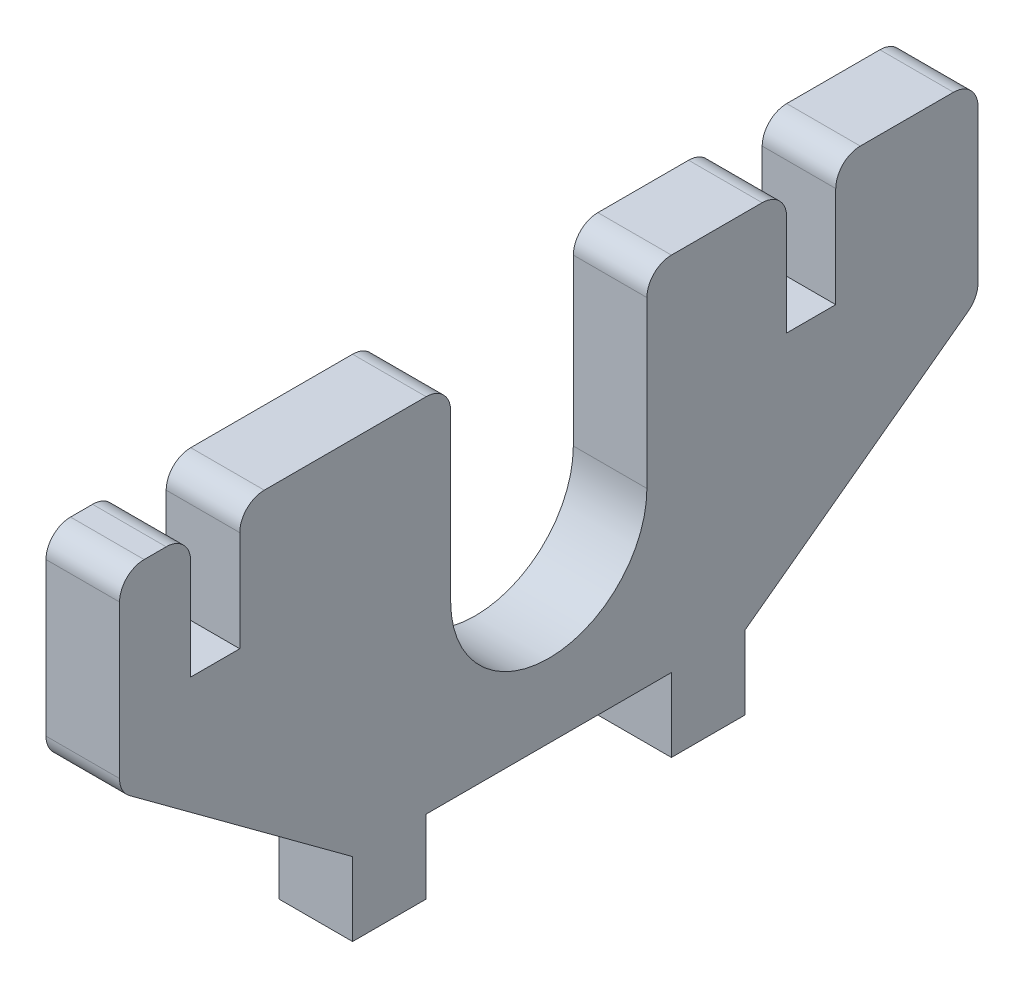
ISO-10303-21;
HEADER;
FILE_DESCRIPTION(('STEP AP214'),'2;1');
FILE_NAME('part.step','',(''),(''),'','','');
FILE_SCHEMA(('AUTOMOTIVE_DESIGN { 1 0 10303 214 1 1 1 1 }'));
ENDSEC;
DATA;
#1=APPLICATION_CONTEXT('core data for automotive mechanical design processes');
#2=APPLICATION_PROTOCOL_DEFINITION('international standard','automotive_design',2000,#1);
#3=PRODUCT_CONTEXT('',#1,'mechanical');
#4=PRODUCT('Part','Part','',(#3));
#5=PRODUCT_RELATED_PRODUCT_CATEGORY('part','',(#4));
#6=PRODUCT_DEFINITION_FORMATION('','',#4);
#7=PRODUCT_DEFINITION_CONTEXT('part definition',#1,'design');
#8=PRODUCT_DEFINITION('design','',#6,#7);
#9=PRODUCT_DEFINITION_SHAPE('','',#8);
#10=(LENGTH_UNIT() NAMED_UNIT(*) SI_UNIT(.MILLI.,.METRE.));
#11=(NAMED_UNIT(*) PLANE_ANGLE_UNIT() SI_UNIT($,.RADIAN.));
#12=(NAMED_UNIT(*) SI_UNIT($,.STERADIAN.) SOLID_ANGLE_UNIT());
#13=UNCERTAINTY_MEASURE_WITH_UNIT(LENGTH_MEASURE(1.E-05),#10,'distance_accuracy_value','');
#14=(GEOMETRIC_REPRESENTATION_CONTEXT(3) GLOBAL_UNCERTAINTY_ASSIGNED_CONTEXT((#13)) GLOBAL_UNIT_ASSIGNED_CONTEXT((#10,
#11,#12)) REPRESENTATION_CONTEXT('',''));
#15=CARTESIAN_POINT('',(0.,0.,0.));
#16=DIRECTION('',(0.,0.,1.));
#17=DIRECTION('',(1.,0.,0.));
#18=AXIS2_PLACEMENT_3D('',#15,#16,#17);
#19=CARTESIAN_POINT('',(0.,0.,0.));
#20=DIRECTION('',(0.,1.,0.));
#21=DIRECTION('',(0.,0.,1.));
#22=AXIS2_PLACEMENT_3D('',#19,#20,#21);
#23=PLANE('',#22);
#24=DIRECTION('',(0.,0.,-1.));
#25=VECTOR('',#24,1.);
#26=CARTESIAN_POINT('',(1185.,0.,0.));
#27=LINE('',#26,#25);
#28=CARTESIAN_POINT('',(1185.,0.,39.9999999999999));
#29=VERTEX_POINT('',#28);
#30=CARTESIAN_POINT('',(1185.,0.,24.9999999999999));
#31=VERTEX_POINT('',#30);
#32=EDGE_CURVE('E331',#29,#31,#27,.T.);
#33=ORIENTED_EDGE('',*,*,#32,.T.);
#34=DIRECTION('',(1.,0.,0.));
#35=VECTOR('',#34,1.);
#36=CARTESIAN_POINT('',(1185.,0.,24.9999999999999));
#37=LINE('',#36,#35);
#38=CARTESIAN_POINT('',(1200.,0.,24.9999999999999));
#39=VERTEX_POINT('',#38);
#40=EDGE_CURVE('E318',#31,#39,#37,.T.);
#41=ORIENTED_EDGE('',*,*,#40,.T.);
#42=DIRECTION('',(0.,0.,-1.));
#43=VECTOR('',#42,1.);
#44=CARTESIAN_POINT('',(1200.,0.,-40.0000000000001));
#45=LINE('',#44,#43);
#46=CARTESIAN_POINT('',(1200.,0.,39.9999999999999));
#47=VERTEX_POINT('',#46);
#48=EDGE_CURVE('E447',#47,#39,#45,.T.);
#49=ORIENTED_EDGE('',*,*,#48,.F.);
#50=DIRECTION('',(1.,0.,0.));
#51=VECTOR('',#50,1.);
#52=CARTESIAN_POINT('',(600.,0.,39.9999999999999));
#53=LINE('',#52,#51);
#54=EDGE_CURVE('E338',#29,#47,#53,.T.);
#55=ORIENTED_EDGE('',*,*,#54,.F.);
#56=EDGE_LOOP('',(#33,#41,#49,#55));
#57=FACE_BOUND('',#56,.T.);
#58=ADVANCED_FACE('F95',(#57),#23,.F.);
#59=CARTESIAN_POINT('',(1125.,50.,0.));
#60=DIRECTION('',(1.,0.,0.));
#61=DIRECTION('',(0.,0.,-1.));
#62=AXIS2_PLACEMENT_3D('',#59,#60,#61);
#63=CYLINDRICAL_SURFACE('',#62,20.);
#64=CARTESIAN_POINT('',(1185.,50.,0.));
#65=DIRECTION('',(-1.,0.,0.));
#66=DIRECTION('',(0.,0.,1.));
#67=AXIS2_PLACEMENT_3D('',#64,#65,#66);
#68=CIRCLE('',#67,20.);
#69=CARTESIAN_POINT('',(1185.,50.,20.));
#70=VERTEX_POINT('',#69);
#71=CARTESIAN_POINT('',(1185.,50.,-20.));
#72=VERTEX_POINT('',#71);
#73=EDGE_CURVE('E351',#70,#72,#68,.F.);
#74=ORIENTED_EDGE('',*,*,#73,.F.);
#75=DIRECTION('',(1.,0.,0.));
#76=VECTOR('',#75,1.);
#77=CARTESIAN_POINT('',(1125.,50.,20.));
#78=LINE('',#77,#76);
#79=CARTESIAN_POINT('',(1200.,50.,20.));
#80=VERTEX_POINT('',#79);
#81=EDGE_CURVE('E421',#70,#80,#78,.T.);
#82=ORIENTED_EDGE('',*,*,#81,.T.);
#83=CARTESIAN_POINT('',(1200.,50.,0.));
#84=DIRECTION('',(1.,0.,0.));
#85=DIRECTION('',(0.,0.,-1.));
#86=AXIS2_PLACEMENT_3D('',#83,#84,#85);
#87=CIRCLE('',#86,20.);
#88=CARTESIAN_POINT('',(1200.,50.,-20.));
#89=VERTEX_POINT('',#88);
#90=EDGE_CURVE('E382',#80,#89,#87,.T.);
#91=ORIENTED_EDGE('',*,*,#90,.T.);
#92=DIRECTION('',(1.,0.,0.));
#93=VECTOR('',#92,1.);
#94=CARTESIAN_POINT('',(1125.,50.,-20.));
#95=LINE('',#94,#93);
#96=EDGE_CURVE('E422',#72,#89,#95,.T.);
#97=ORIENTED_EDGE('',*,*,#96,.F.);
#98=EDGE_LOOP('',(#74,#82,#91,#97));
#99=FACE_BOUND('',#98,.T.);
#100=ADVANCED_FACE('F664',(#99),#63,.F.);
#101=CARTESIAN_POINT('',(1125.,0.,-20.));
#102=DIRECTION('',(0.,0.,1.));
#103=DIRECTION('',(1.,0.,0.));
#104=AXIS2_PLACEMENT_3D('',#101,#102,#103);
#105=PLANE('',#104);
#106=DIRECTION('',(0.,-1.,0.));
#107=VECTOR('',#106,1.);
#108=CARTESIAN_POINT('',(1200.,0.,-20.));
#109=LINE('',#108,#107);
#110=CARTESIAN_POINT('',(1200.,83.7000000000001,-20.));
#111=VERTEX_POINT('',#110);
#112=EDGE_CURVE('E419',#111,#89,#109,.T.);
#113=ORIENTED_EDGE('',*,*,#112,.F.);
#114=DIRECTION('',(1.,0.,0.));
#115=VECTOR('',#114,1.);
#116=CARTESIAN_POINT('',(1185.,83.7000000000001,-20.));
#117=LINE('',#116,#115);
#118=CARTESIAN_POINT('',(1185.,83.7000000000001,-20.));
#119=VERTEX_POINT('',#118);
#120=EDGE_CURVE('E528',#111,#119,#117,.F.);
#121=ORIENTED_EDGE('',*,*,#120,.T.);
#122=DIRECTION('',(0.,-1.,0.));
#123=VECTOR('',#122,1.);
#124=CARTESIAN_POINT('',(1185.,0.,-20.));
#125=LINE('',#124,#123);
#126=EDGE_CURVE('E354',#119,#72,#125,.T.);
#127=ORIENTED_EDGE('',*,*,#126,.T.);
#128=ORIENTED_EDGE('',*,*,#96,.T.);
#129=EDGE_LOOP('',(#113,#121,#127,#128));
#130=FACE_BOUND('',#129,.T.);
#131=ADVANCED_FACE('F669',(#130),#105,.T.);
#132=CARTESIAN_POINT('',(1125.,88.7000000000001,0.));
#133=DIRECTION('',(0.,-1.,0.));
#134=DIRECTION('',(0.,0.,-1.));
#135=AXIS2_PLACEMENT_3D('',#132,#133,#134);
#136=PLANE('',#135);
#137=DIRECTION('',(0.,0.,-1.));
#138=VECTOR('',#137,1.);
#139=CARTESIAN_POINT('',(1200.,88.7000000000001,0.));
#140=LINE('',#139,#138);
#141=CARTESIAN_POINT('',(1200.,88.7000000000001,-25.));
#142=VERTEX_POINT('',#141);
#143=CARTESIAN_POINT('',(1200.,88.7000000000001,-43.5000000000001));
#144=VERTEX_POINT('',#143);
#145=EDGE_CURVE('E418',#142,#144,#140,.T.);
#146=ORIENTED_EDGE('',*,*,#145,.T.);
#147=DIRECTION('',(1.,0.,0.));
#148=VECTOR('',#147,1.);
#149=CARTESIAN_POINT('',(1125.,88.7000000000001,-43.5000000000001));
#150=LINE('',#149,#148);
#151=CARTESIAN_POINT('',(1185.,88.7000000000001,-43.5000000000001));
#152=VERTEX_POINT('',#151);
#153=EDGE_CURVE('E526',#144,#152,#150,.F.);
#154=ORIENTED_EDGE('',*,*,#153,.T.);
#155=DIRECTION('',(0.,0.,1.));
#156=VECTOR('',#155,1.);
#157=CARTESIAN_POINT('',(1185.,88.7000000000001,-300.));
#158=LINE('',#157,#156);
#159=CARTESIAN_POINT('',(1185.,88.7000000000001,-25.));
#160=VERTEX_POINT('',#159);
#161=EDGE_CURVE('E347',#152,#160,#158,.T.);
#162=ORIENTED_EDGE('',*,*,#161,.T.);
#163=DIRECTION('',(1.,0.,0.));
#164=VECTOR('',#163,1.);
#165=CARTESIAN_POINT('',(1200.,88.7000000000001,-25.));
#166=LINE('',#165,#164);
#167=EDGE_CURVE('E523',#160,#142,#166,.T.);
#168=ORIENTED_EDGE('',*,*,#167,.T.);
#169=EDGE_LOOP('',(#146,#154,#162,#168));
#170=FACE_BOUND('',#169,.T.);
#171=ADVANCED_FACE('F673',(#170),#136,.F.);
#172=CARTESIAN_POINT('',(1125.,0.,-48.5000000000001));
#173=DIRECTION('',(0.,0.,1.));
#174=DIRECTION('',(0.,-1.,0.));
#175=AXIS2_PLACEMENT_3D('',#172,#173,#174);
#176=PLANE('',#175);
#177=DIRECTION('',(0.,-1.,0.));
#178=VECTOR('',#177,1.);
#179=CARTESIAN_POINT('',(1185.,0.,-48.5000000000001));
#180=LINE('',#179,#178);
#181=CARTESIAN_POINT('',(1185.,83.7000000000001,-48.5000000000001));
#182=VERTEX_POINT('',#181);
#183=CARTESIAN_POINT('',(1185.,63.2000000000001,-48.5000000000001));
#184=VERTEX_POINT('',#183);
#185=EDGE_CURVE('E380',#182,#184,#180,.T.);
#186=ORIENTED_EDGE('',*,*,#185,.F.);
#187=DIRECTION('',(1.,0.,0.));
#188=VECTOR('',#187,1.);
#189=CARTESIAN_POINT('',(1125.,83.7000000000001,-48.5000000000001));
#190=LINE('',#189,#188);
#191=CARTESIAN_POINT('',(1200.,83.7000000000001,-48.5000000000001));
#192=VERTEX_POINT('',#191);
#193=EDGE_CURVE('E520',#182,#192,#190,.T.);
#194=ORIENTED_EDGE('',*,*,#193,.T.);
#195=DIRECTION('',(0.,-1.,0.));
#196=VECTOR('',#195,1.);
#197=CARTESIAN_POINT('',(1200.,0.,-48.5000000000001));
#198=LINE('',#197,#196);
#199=CARTESIAN_POINT('',(1200.,63.2000000000001,-48.5000000000001));
#200=VERTEX_POINT('',#199);
#201=EDGE_CURVE('E416',#192,#200,#198,.T.);
#202=ORIENTED_EDGE('',*,*,#201,.T.);
#203=DIRECTION('',(1.,0.,0.));
#204=VECTOR('',#203,1.);
#205=CARTESIAN_POINT('',(1125.,63.2000000000001,-48.5000000000001));
#206=LINE('',#205,#204);
#207=EDGE_CURVE('E425',#184,#200,#206,.T.);
#208=ORIENTED_EDGE('',*,*,#207,.F.);
#209=EDGE_LOOP('',(#186,#194,#202,#208));
#210=FACE_BOUND('',#209,.T.);
#211=ADVANCED_FACE('F682',(#210),#176,.F.);
#212=CARTESIAN_POINT('',(1125.,63.2000000000001,0.));
#213=DIRECTION('',(0.,-1.,0.));
#214=DIRECTION('',(0.,0.,-1.));
#215=AXIS2_PLACEMENT_3D('',#212,#213,#214);
#216=PLANE('',#215);
#217=DIRECTION('',(0.,0.,-1.));
#218=VECTOR('',#217,1.);
#219=CARTESIAN_POINT('',(1185.,63.2000000000001,0.));
#220=LINE('',#219,#218);
#221=CARTESIAN_POINT('',(1185.,63.2000000000001,-58.5000000000001));
#222=VERTEX_POINT('',#221);
#223=EDGE_CURVE('E377',#184,#222,#220,.T.);
#224=ORIENTED_EDGE('',*,*,#223,.F.);
#225=ORIENTED_EDGE('',*,*,#207,.T.);
#226=DIRECTION('',(0.,0.,-1.));
#227=VECTOR('',#226,1.);
#228=CARTESIAN_POINT('',(1200.,63.2000000000001,0.));
#229=LINE('',#228,#227);
#230=CARTESIAN_POINT('',(1200.,63.2000000000001,-58.5000000000001));
#231=VERTEX_POINT('',#230);
#232=EDGE_CURVE('E413',#200,#231,#229,.T.);
#233=ORIENTED_EDGE('',*,*,#232,.T.);
#234=DIRECTION('',(1.,0.,0.));
#235=VECTOR('',#234,1.);
#236=CARTESIAN_POINT('',(1125.,63.2000000000001,-58.5000000000001));
#237=LINE('',#236,#235);
#238=EDGE_CURVE('E428',#222,#231,#237,.T.);
#239=ORIENTED_EDGE('',*,*,#238,.F.);
#240=EDGE_LOOP('',(#224,#225,#233,#239));
#241=FACE_BOUND('',#240,.T.);
#242=ADVANCED_FACE('F688',(#241),#216,.F.);
#243=CARTESIAN_POINT('',(1125.,0.,-58.5000000000001));
#244=DIRECTION('',(0.,0.,1.));
#245=DIRECTION('',(0.,-1.,0.));
#246=AXIS2_PLACEMENT_3D('',#243,#244,#245);
#247=PLANE('',#246);
#248=DIRECTION('',(0.,-1.,0.));
#249=VECTOR('',#248,1.);
#250=CARTESIAN_POINT('',(1200.,0.,-58.5000000000001));
#251=LINE('',#250,#249);
#252=CARTESIAN_POINT('',(1200.,83.7000000000001,-58.5000000000001));
#253=VERTEX_POINT('',#252);
#254=EDGE_CURVE('E411',#253,#231,#251,.T.);
#255=ORIENTED_EDGE('',*,*,#254,.F.);
#256=DIRECTION('',(1.,0.,0.));
#257=VECTOR('',#256,1.);
#258=CARTESIAN_POINT('',(1185.,83.7000000000001,-58.5000000000001));
#259=LINE('',#258,#257);
#260=CARTESIAN_POINT('',(1185.,83.7000000000001,-58.5000000000001));
#261=VERTEX_POINT('',#260);
#262=EDGE_CURVE('E518',#253,#261,#259,.F.);
#263=ORIENTED_EDGE('',*,*,#262,.T.);
#264=DIRECTION('',(0.,-1.,0.));
#265=VECTOR('',#264,1.);
#266=CARTESIAN_POINT('',(1185.,0.,-58.5000000000001));
#267=LINE('',#266,#265);
#268=EDGE_CURVE('E375',#261,#222,#267,.T.);
#269=ORIENTED_EDGE('',*,*,#268,.T.);
#270=ORIENTED_EDGE('',*,*,#238,.T.);
#271=EDGE_LOOP('',(#255,#263,#269,#270));
#272=FACE_BOUND('',#271,.T.);
#273=ADVANCED_FACE('F691',(#272),#247,.T.);
#274=CARTESIAN_POINT('',(1200.,88.7000000000001,-63.5000000000001));
#275=VERTEX_POINT('',#274);
#276=CARTESIAN_POINT('',(1200.,88.7000000000001,-82.5));
#277=VERTEX_POINT('',#276);
#278=EDGE_CURVE('E394',#275,#277,#140,.T.);
#279=ORIENTED_EDGE('',*,*,#278,.T.);
#280=DIRECTION('',(1.,0.,0.));
#281=VECTOR('',#280,1.);
#282=CARTESIAN_POINT('',(1125.,88.7000000000001,-82.5));
#283=LINE('',#282,#281);
#284=CARTESIAN_POINT('',(1185.,88.7000000000001,-82.5));
#285=VERTEX_POINT('',#284);
#286=EDGE_CURVE('E516',#277,#285,#283,.F.);
#287=ORIENTED_EDGE('',*,*,#286,.T.);
#288=CARTESIAN_POINT('',(1185.,88.7000000000001,-63.5000000000001));
#289=VERTEX_POINT('',#288);
#290=EDGE_CURVE('E349',#285,#289,#158,.T.);
#291=ORIENTED_EDGE('',*,*,#290,.T.);
#292=DIRECTION('',(1.,0.,0.));
#293=VECTOR('',#292,1.);
#294=CARTESIAN_POINT('',(1200.,88.7000000000001,-63.5000000000001));
#295=LINE('',#294,#293);
#296=EDGE_CURVE('E513',#289,#275,#295,.T.);
#297=ORIENTED_EDGE('',*,*,#296,.T.);
#298=EDGE_LOOP('',(#279,#287,#291,#297));
#299=FACE_BOUND('',#298,.T.);
#300=ADVANCED_FACE('F640',(#299),#136,.F.);
#301=CARTESIAN_POINT('',(1125.,0.,-87.5));
#302=DIRECTION('',(0.,0.,1.));
#303=DIRECTION('',(1.,0.,0.));
#304=AXIS2_PLACEMENT_3D('',#301,#302,#303);
#305=PLANE('',#304);
#306=DIRECTION('',(0.,-1.,0.));
#307=VECTOR('',#306,1.);
#308=CARTESIAN_POINT('',(1200.,0.,-87.5));
#309=LINE('',#308,#307);
#310=CARTESIAN_POINT('',(1200.,83.7000000000001,-87.5));
#311=VERTEX_POINT('',#310);
#312=CARTESIAN_POINT('',(1200.,52.5265388006347,-87.5));
#313=VERTEX_POINT('',#312);
#314=EDGE_CURVE('E408',#311,#313,#309,.T.);
#315=ORIENTED_EDGE('',*,*,#314,.T.);
#316=DIRECTION('',(1.,0.,0.));
#317=VECTOR('',#316,1.);
#318=CARTESIAN_POINT('',(1125.,52.5265388006347,-87.5));
#319=LINE('',#318,#317);
#320=CARTESIAN_POINT('',(1185.,52.5265388006347,-87.5));
#321=VERTEX_POINT('',#320);
#322=EDGE_CURVE('E511',#313,#321,#319,.F.);
#323=ORIENTED_EDGE('',*,*,#322,.T.);
#324=DIRECTION('',(0.,-1.,0.));
#325=VECTOR('',#324,1.);
#326=CARTESIAN_POINT('',(1185.,0.,-87.5));
#327=LINE('',#326,#325);
#328=CARTESIAN_POINT('',(1185.,83.7000000000001,-87.5));
#329=VERTEX_POINT('',#328);
#330=EDGE_CURVE('E372',#329,#321,#327,.T.);
#331=ORIENTED_EDGE('',*,*,#330,.F.);
#332=DIRECTION('',(1.,0.,0.));
#333=VECTOR('',#332,1.);
#334=CARTESIAN_POINT('',(1125.,83.7000000000001,-87.5));
#335=LINE('',#334,#333);
#336=EDGE_CURVE('E508',#329,#311,#335,.T.);
#337=ORIENTED_EDGE('',*,*,#336,.T.);
#338=EDGE_LOOP('',(#315,#323,#331,#337));
#339=FACE_BOUND('',#338,.T.);
#340=ADVANCED_FACE('F629',(#339),#305,.F.);
#341=CARTESIAN_POINT('',(1125.,-9.38061041292646,-6.91202872531425));
#342=DIRECTION('',(0.,0.805055837353367,0.593199038049851));
#343=DIRECTION('',(0.,-0.593199038049851,0.805055837353367));
#344=AXIS2_PLACEMENT_3D('',#341,#342,#343);
#345=PLANE('',#344);
#346=DIRECTION('',(0.,-0.593199038049851,0.805055837353367));
#347=VECTOR('',#346,1.);
#348=CARTESIAN_POINT('',(1185.,-9.38061041292646,-6.91202872531425));
#349=LINE('',#348,#347);
#350=CARTESIAN_POINT('',(1185.,48.5012596138679,-85.4659951902492));
#351=VERTEX_POINT('',#350);
#352=CARTESIAN_POINT('',(1185.,15.,-40.0000000000001));
#353=VERTEX_POINT('',#352);
#354=EDGE_CURVE('E369',#351,#353,#349,.T.);
#355=ORIENTED_EDGE('',*,*,#354,.F.);
#356=DIRECTION('',(1.,0.,0.));
#357=VECTOR('',#356,1.);
#358=CARTESIAN_POINT('',(1125.,48.5012596138679,-85.4659951902492));
#359=LINE('',#358,#357);
#360=CARTESIAN_POINT('',(1200.,48.5012596138679,-85.4659951902493));
#361=VERTEX_POINT('',#360);
#362=EDGE_CURVE('E505',#351,#361,#359,.T.);
#363=ORIENTED_EDGE('',*,*,#362,.T.);
#364=DIRECTION('',(0.,-0.593199038049851,0.805055837353367));
#365=VECTOR('',#364,1.);
#366=CARTESIAN_POINT('',(1200.,-9.38061041292646,-6.91202872531425));
#367=LINE('',#366,#365);
#368=CARTESIAN_POINT('',(1200.,15.,-40.0000000000001));
#369=VERTEX_POINT('',#368);
#370=EDGE_CURVE('E406',#361,#369,#367,.T.);
#371=ORIENTED_EDGE('',*,*,#370,.T.);
#372=DIRECTION('',(-1.,0.,0.));
#373=VECTOR('',#372,1.);
#374=CARTESIAN_POINT('',(600.,15.,-39.9999999999999));
#375=LINE('',#374,#373);
#376=EDGE_CURVE('E440',#369,#353,#375,.T.);
#377=ORIENTED_EDGE('',*,*,#376,.T.);
#378=EDGE_LOOP('',(#355,#363,#371,#377));
#379=FACE_BOUND('',#378,.T.);
#380=ADVANCED_FACE('F621',(#379),#345,.F.);
#381=CARTESIAN_POINT('',(1125.,-9.38061041292634,6.91202872531413));
#382=DIRECTION('',(0.,0.805055837353368,-0.593199038049849));
#383=DIRECTION('',(0.,0.593199038049849,0.805055837353368));
#384=AXIS2_PLACEMENT_3D('',#381,#382,#383);
#385=PLANE('',#384);
#386=DIRECTION('',(0.,0.59319903804985,0.805055837353369));
#387=VECTOR('',#386,1.);
#388=CARTESIAN_POINT('',(1200.,-9.38061041292634,6.91202872531413));
#389=LINE('',#388,#387);
#390=CARTESIAN_POINT('',(1200.,15.,39.9999999999999));
#391=VERTEX_POINT('',#390);
#392=CARTESIAN_POINT('',(1200.,48.5012596138679,85.4659951902493));
#393=VERTEX_POINT('',#392);
#394=EDGE_CURVE('E403',#391,#393,#389,.T.);
#395=ORIENTED_EDGE('',*,*,#394,.T.);
#396=DIRECTION('',(1.,0.,0.));
#397=VECTOR('',#396,1.);
#398=CARTESIAN_POINT('',(1125.,48.5012596138679,85.4659951902492));
#399=LINE('',#398,#397);
#400=CARTESIAN_POINT('',(1185.,48.5012596138679,85.4659951902492));
#401=VERTEX_POINT('',#400);
#402=EDGE_CURVE('E484',#393,#401,#399,.F.);
#403=ORIENTED_EDGE('',*,*,#402,.T.);
#404=DIRECTION('',(0.,0.593199038049849,0.805055837353368));
#405=VECTOR('',#404,1.);
#406=CARTESIAN_POINT('',(1185.,-9.38061041292634,6.91202872531413));
#407=LINE('',#406,#405);
#408=CARTESIAN_POINT('',(1185.,15.,39.9999999999999));
#409=VERTEX_POINT('',#408);
#410=EDGE_CURVE('E366',#409,#401,#407,.T.);
#411=ORIENTED_EDGE('',*,*,#410,.F.);
#412=DIRECTION('',(1.,0.,0.));
#413=VECTOR('',#412,1.);
#414=CARTESIAN_POINT('',(1125.,15.,39.9999999999999));
#415=LINE('',#414,#413);
#416=EDGE_CURVE('E431',#409,#391,#415,.T.);
#417=ORIENTED_EDGE('',*,*,#416,.T.);
#418=EDGE_LOOP('',(#395,#403,#411,#417));
#419=FACE_BOUND('',#418,.T.);
#420=ADVANCED_FACE('F583',(#419),#385,.F.);
#421=CARTESIAN_POINT('',(1125.,0.,87.5));
#422=DIRECTION('',(0.,0.,-1.));
#423=DIRECTION('',(-1.,0.,0.));
#424=AXIS2_PLACEMENT_3D('',#421,#422,#423);
#425=PLANE('',#424);
#426=DIRECTION('',(0.,1.,0.));
#427=VECTOR('',#426,1.);
#428=CARTESIAN_POINT('',(1185.,0.,87.5));
#429=LINE('',#428,#427);
#430=CARTESIAN_POINT('',(1185.,52.5265388006347,87.5));
#431=VERTEX_POINT('',#430);
#432=CARTESIAN_POINT('',(1185.,83.7,87.5));
#433=VERTEX_POINT('',#432);
#434=EDGE_CURVE('E363',#431,#433,#429,.T.);
#435=ORIENTED_EDGE('',*,*,#434,.F.);
#436=DIRECTION('',(1.,0.,0.));
#437=VECTOR('',#436,1.);
#438=CARTESIAN_POINT('',(1125.,52.5265388006347,87.5));
#439=LINE('',#438,#437);
#440=CARTESIAN_POINT('',(1200.,52.5265388006347,87.5));
#441=VERTEX_POINT('',#440);
#442=EDGE_CURVE('E461',#431,#441,#439,.T.);
#443=ORIENTED_EDGE('',*,*,#442,.T.);
#444=DIRECTION('',(0.,1.,0.));
#445=VECTOR('',#444,1.);
#446=CARTESIAN_POINT('',(1200.,0.,87.5));
#447=LINE('',#446,#445);
#448=CARTESIAN_POINT('',(1200.,83.7,87.5));
#449=VERTEX_POINT('',#448);
#450=EDGE_CURVE('E392',#441,#449,#447,.T.);
#451=ORIENTED_EDGE('',*,*,#450,.T.);
#452=DIRECTION('',(1.,0.,0.));
#453=VECTOR('',#452,1.);
#454=CARTESIAN_POINT('',(1125.,83.7,87.5));
#455=LINE('',#454,#453);
#456=EDGE_CURVE('E459',#449,#433,#455,.F.);
#457=ORIENTED_EDGE('',*,*,#456,.T.);
#458=EDGE_LOOP('',(#435,#443,#451,#457));
#459=FACE_BOUND('',#458,.T.);
#460=ADVANCED_FACE('F573',(#459),#425,.F.);
#461=CARTESIAN_POINT('',(1185.,88.7000000000001,77.9999999999996));
#462=VERTEX_POINT('',#461);
#463=CARTESIAN_POINT('',(1185.,88.7000000000001,82.5));
#464=VERTEX_POINT('',#463);
#465=EDGE_CURVE('E342',#462,#464,#158,.T.);
#466=ORIENTED_EDGE('',*,*,#465,.T.);
#467=DIRECTION('',(1.,0.,0.));
#468=VECTOR('',#467,1.);
#469=CARTESIAN_POINT('',(1125.,88.7000000000001,82.5));
#470=LINE('',#469,#468);
#471=CARTESIAN_POINT('',(1200.,88.7000000000001,82.5));
#472=VERTEX_POINT('',#471);
#473=EDGE_CURVE('E539',#464,#472,#470,.T.);
#474=ORIENTED_EDGE('',*,*,#473,.T.);
#475=CARTESIAN_POINT('',(1200.,88.7000000000001,77.9999999999996));
#476=VERTEX_POINT('',#475);
#477=EDGE_CURVE('E389',#472,#476,#140,.T.);
#478=ORIENTED_EDGE('',*,*,#477,.T.);
#479=DIRECTION('',(1.,0.,0.));
#480=VECTOR('',#479,1.);
#481=CARTESIAN_POINT('',(1125.,88.7000000000001,77.9999999999996));
#482=LINE('',#481,#480);
#483=EDGE_CURVE('E537',#476,#462,#482,.F.);
#484=ORIENTED_EDGE('',*,*,#483,.T.);
#485=EDGE_LOOP('',(#466,#474,#478,#484));
#486=FACE_BOUND('',#485,.T.);
#487=ADVANCED_FACE('F566',(#486),#136,.F.);
#488=CARTESIAN_POINT('',(1125.,0.,72.9999999999996));
#489=DIRECTION('',(0.,0.,1.));
#490=DIRECTION('',(1.,0.,0.));
#491=AXIS2_PLACEMENT_3D('',#488,#489,#490);
#492=PLANE('',#491);
#493=DIRECTION('',(0.,-1.,0.));
#494=VECTOR('',#493,1.);
#495=CARTESIAN_POINT('',(1185.,0.,72.9999999999996));
#496=LINE('',#495,#494);
#497=CARTESIAN_POINT('',(1185.,83.7,72.9999999999996));
#498=VERTEX_POINT('',#497);
#499=CARTESIAN_POINT('',(1185.,63.1999999999999,72.9999999999996));
#500=VERTEX_POINT('',#499);
#501=EDGE_CURVE('E361',#498,#500,#496,.T.);
#502=ORIENTED_EDGE('',*,*,#501,.F.);
#503=DIRECTION('',(1.,0.,0.));
#504=VECTOR('',#503,1.);
#505=CARTESIAN_POINT('',(1125.,83.7,72.9999999999996));
#506=LINE('',#505,#504);
#507=CARTESIAN_POINT('',(1200.,83.7,72.9999999999996));
#508=VERTEX_POINT('',#507);
#509=EDGE_CURVE('E103',#498,#508,#506,.T.);
#510=ORIENTED_EDGE('',*,*,#509,.T.);
#511=DIRECTION('',(0.,-1.,0.));
#512=VECTOR('',#511,1.);
#513=CARTESIAN_POINT('',(1200.,0.,72.9999999999996));
#514=LINE('',#513,#512);
#515=CARTESIAN_POINT('',(1200.,63.1999999999999,72.9999999999996));
#516=VERTEX_POINT('',#515);
#517=EDGE_CURVE('E393',#508,#516,#514,.T.);
#518=ORIENTED_EDGE('',*,*,#517,.T.);
#519=DIRECTION('',(1.,0.,0.));
#520=VECTOR('',#519,1.);
#521=CARTESIAN_POINT('',(1125.,63.1999999999999,72.9999999999996));
#522=LINE('',#521,#520);
#523=EDGE_CURVE('E433',#500,#516,#522,.T.);
#524=ORIENTED_EDGE('',*,*,#523,.F.);
#525=EDGE_LOOP('',(#502,#510,#518,#524));
#526=FACE_BOUND('',#525,.T.);
#527=ADVANCED_FACE('F546',(#526),#492,.F.);
#528=CARTESIAN_POINT('',(1125.,63.1999999999999,0.));
#529=DIRECTION('',(0.,-1.,0.));
#530=DIRECTION('',(0.,0.,-1.));
#531=AXIS2_PLACEMENT_3D('',#528,#529,#530);
#532=PLANE('',#531);
#533=DIRECTION('',(0.,0.,-1.));
#534=VECTOR('',#533,1.);
#535=CARTESIAN_POINT('',(1185.,63.1999999999999,0.));
#536=LINE('',#535,#534);
#537=CARTESIAN_POINT('',(1185.,63.1999999999999,62.9999999999998));
#538=VERTEX_POINT('',#537);
#539=EDGE_CURVE('E358',#500,#538,#536,.T.);
#540=ORIENTED_EDGE('',*,*,#539,.F.);
#541=ORIENTED_EDGE('',*,*,#523,.T.);
#542=DIRECTION('',(0.,0.,-1.));
#543=VECTOR('',#542,1.);
#544=CARTESIAN_POINT('',(1200.,63.1999999999999,0.));
#545=LINE('',#544,#543);
#546=CARTESIAN_POINT('',(1200.,63.1999999999999,62.9999999999998));
#547=VERTEX_POINT('',#546);
#548=EDGE_CURVE('E397',#516,#547,#545,.T.);
#549=ORIENTED_EDGE('',*,*,#548,.T.);
#550=DIRECTION('',(1.,0.,0.));
#551=VECTOR('',#550,1.);
#552=CARTESIAN_POINT('',(1125.,63.1999999999999,62.9999999999998));
#553=LINE('',#552,#551);
#554=EDGE_CURVE('E436',#538,#547,#553,.T.);
#555=ORIENTED_EDGE('',*,*,#554,.F.);
#556=EDGE_LOOP('',(#540,#541,#549,#555));
#557=FACE_BOUND('',#556,.T.);
#558=ADVANCED_FACE('F558',(#557),#532,.F.);
#559=CARTESIAN_POINT('',(1125.,0.,62.9999999999998));
#560=DIRECTION('',(0.,0.,1.));
#561=DIRECTION('',(1.,0.,0.));
#562=AXIS2_PLACEMENT_3D('',#559,#560,#561);
#563=PLANE('',#562);
#564=DIRECTION('',(0.,-1.,0.));
#565=VECTOR('',#564,1.);
#566=CARTESIAN_POINT('',(1200.,0.,62.9999999999998));
#567=LINE('',#566,#565);
#568=CARTESIAN_POINT('',(1200.,83.7,62.9999999999998));
#569=VERTEX_POINT('',#568);
#570=EDGE_CURVE('E395',#569,#547,#567,.T.);
#571=ORIENTED_EDGE('',*,*,#570,.F.);
#572=DIRECTION('',(1.,0.,0.));
#573=VECTOR('',#572,1.);
#574=CARTESIAN_POINT('',(1185.,83.7,62.9999999999998));
#575=LINE('',#574,#573);
#576=CARTESIAN_POINT('',(1185.,83.7,62.9999999999998));
#577=VERTEX_POINT('',#576);
#578=EDGE_CURVE('E535',#569,#577,#575,.F.);
#579=ORIENTED_EDGE('',*,*,#578,.T.);
#580=DIRECTION('',(0.,-1.,0.));
#581=VECTOR('',#580,1.);
#582=CARTESIAN_POINT('',(1185.,0.,62.9999999999998));
#583=LINE('',#582,#581);
#584=EDGE_CURVE('E356',#577,#538,#583,.T.);
#585=ORIENTED_EDGE('',*,*,#584,.T.);
#586=ORIENTED_EDGE('',*,*,#554,.T.);
#587=EDGE_LOOP('',(#571,#579,#585,#586));
#588=FACE_BOUND('',#587,.T.);
#589=ADVANCED_FACE('F724',(#588),#563,.T.);
#590=CARTESIAN_POINT('',(1185.,88.7000000000001,25.));
#591=VERTEX_POINT('',#590);
#592=CARTESIAN_POINT('',(1185.,88.7000000000001,57.9999999999998));
#593=VERTEX_POINT('',#592);
#594=EDGE_CURVE('E350',#591,#593,#158,.T.);
#595=ORIENTED_EDGE('',*,*,#594,.T.);
#596=DIRECTION('',(1.,0.,0.));
#597=VECTOR('',#596,1.);
#598=CARTESIAN_POINT('',(1200.,88.7000000000001,57.9999999999998));
#599=LINE('',#598,#597);
#600=CARTESIAN_POINT('',(1200.,88.7000000000001,57.9999999999998));
#601=VERTEX_POINT('',#600);
#602=EDGE_CURVE('E532',#593,#601,#599,.T.);
#603=ORIENTED_EDGE('',*,*,#602,.T.);
#604=CARTESIAN_POINT('',(1200.,88.7000000000001,25.));
#605=VERTEX_POINT('',#604);
#606=EDGE_CURVE('E388',#601,#605,#140,.T.);
#607=ORIENTED_EDGE('',*,*,#606,.T.);
#608=DIRECTION('',(1.,0.,0.));
#609=VECTOR('',#608,1.);
#610=CARTESIAN_POINT('',(1185.,88.7000000000001,25.));
#611=LINE('',#610,#609);
#612=EDGE_CURVE('E530',#605,#591,#611,.F.);
#613=ORIENTED_EDGE('',*,*,#612,.T.);
#614=EDGE_LOOP('',(#595,#603,#607,#613));
#615=FACE_BOUND('',#614,.T.);
#616=ADVANCED_FACE('F651',(#615),#136,.F.);
#617=CARTESIAN_POINT('',(1125.,0.,20.));
#618=DIRECTION('',(0.,0.,-1.));
#619=DIRECTION('',(-1.,0.,0.));
#620=AXIS2_PLACEMENT_3D('',#617,#618,#619);
#621=PLANE('',#620);
#622=DIRECTION('',(0.,1.,0.));
#623=VECTOR('',#622,1.);
#624=CARTESIAN_POINT('',(1185.,0.,20.));
#625=LINE('',#624,#623);
#626=CARTESIAN_POINT('',(1185.,83.7000000000001,20.));
#627=VERTEX_POINT('',#626);
#628=EDGE_CURVE('E456',#70,#627,#625,.T.);
#629=ORIENTED_EDGE('',*,*,#628,.T.);
#630=DIRECTION('',(1.,0.,0.));
#631=VECTOR('',#630,1.);
#632=CARTESIAN_POINT('',(1200.,83.7000000000001,20.));
#633=LINE('',#632,#631);
#634=CARTESIAN_POINT('',(1200.,83.7000000000001,20.));
#635=VERTEX_POINT('',#634);
#636=EDGE_CURVE('E12',#627,#635,#633,.T.);
#637=ORIENTED_EDGE('',*,*,#636,.T.);
#638=DIRECTION('',(0.,1.,0.));
#639=VECTOR('',#638,1.);
#640=CARTESIAN_POINT('',(1200.,0.,20.));
#641=LINE('',#640,#639);
#642=EDGE_CURVE('E385',#80,#635,#641,.T.);
#643=ORIENTED_EDGE('',*,*,#642,.F.);
#644=ORIENTED_EDGE('',*,*,#81,.F.);
#645=EDGE_LOOP('',(#629,#637,#643,#644));
#646=FACE_BOUND('',#645,.T.);
#647=ADVANCED_FACE('F660',(#646),#621,.T.);
#648=CARTESIAN_POINT('',(1200.,0.,-24.9999999999999));
#649=VERTEX_POINT('',#648);
#650=CARTESIAN_POINT('',(1200.,0.,-40.0000000000001));
#651=VERTEX_POINT('',#650);
#652=EDGE_CURVE('E446',#649,#651,#45,.T.);
#653=ORIENTED_EDGE('',*,*,#652,.F.);
#654=DIRECTION('',(1.,0.,0.));
#655=VECTOR('',#654,1.);
#656=CARTESIAN_POINT('',(1185.,0.,-24.9999999999999));
#657=LINE('',#656,#655);
#658=CARTESIAN_POINT('',(1185.,0.,-24.9999999999999));
#659=VERTEX_POINT('',#658);
#660=EDGE_CURVE('E328',#659,#649,#657,.T.);
#661=ORIENTED_EDGE('',*,*,#660,.F.);
#662=CARTESIAN_POINT('',(1185.,0.,-40.0000000000001));
#663=VERTEX_POINT('',#662);
#664=EDGE_CURVE('E340',#659,#663,#27,.T.);
#665=ORIENTED_EDGE('',*,*,#664,.T.);
#666=DIRECTION('',(-1.,0.,0.));
#667=VECTOR('',#666,1.);
#668=CARTESIAN_POINT('',(600.,0.,-39.9999999999999));
#669=LINE('',#668,#667);
#670=EDGE_CURVE('E444',#651,#663,#669,.T.);
#671=ORIENTED_EDGE('',*,*,#670,.F.);
#672=EDGE_LOOP('',(#653,#661,#665,#671));
#673=FACE_BOUND('',#672,.T.);
#674=ADVANCED_FACE('F612',(#673),#23,.F.);
#675=CARTESIAN_POINT('',(600.,15.,39.9999999999999));
#676=DIRECTION('',(0.,0.,-1.));
#677=DIRECTION('',(-1.,0.,0.));
#678=AXIS2_PLACEMENT_3D('',#675,#676,#677);
#679=PLANE('',#678);
#680=ORIENTED_EDGE('',*,*,#416,.F.);
#681=DIRECTION('',(0.,-1.,0.));
#682=VECTOR('',#681,1.);
#683=CARTESIAN_POINT('',(1185.,15.,39.9999999999999));
#684=LINE('',#683,#682);
#685=EDGE_CURVE('E339',#409,#29,#684,.T.);
#686=ORIENTED_EDGE('',*,*,#685,.T.);
#687=ORIENTED_EDGE('',*,*,#54,.T.);
#688=DIRECTION('',(0.,-1.,0.));
#689=VECTOR('',#688,1.);
#690=CARTESIAN_POINT('',(1200.,15.,39.9999999999999));
#691=LINE('',#690,#689);
#692=EDGE_CURVE('E453',#391,#47,#691,.T.);
#693=ORIENTED_EDGE('',*,*,#692,.F.);
#694=EDGE_LOOP('',(#680,#686,#687,#693));
#695=FACE_BOUND('',#694,.T.);
#696=ADVANCED_FACE('F588',(#695),#679,.F.);
#697=CARTESIAN_POINT('',(1200.,15.,-40.0000000000001));
#698=DIRECTION('',(-1.,0.,0.));
#699=DIRECTION('',(0.,0.,1.));
#700=AXIS2_PLACEMENT_3D('',#697,#698,#699);
#701=PLANE('',#700);
#702=ORIENTED_EDGE('',*,*,#48,.T.);
#703=DIRECTION('',(0.,-1.,0.));
#704=VECTOR('',#703,1.);
#705=CARTESIAN_POINT('',(1200.,0.,24.9999999999999));
#706=LINE('',#705,#704);
#707=CARTESIAN_POINT('',(1200.,15.,24.9999999999999));
#708=VERTEX_POINT('',#707);
#709=EDGE_CURVE('E323',#708,#39,#706,.T.);
#710=ORIENTED_EDGE('',*,*,#709,.F.);
#711=DIRECTION('',(0.,0.,1.));
#712=VECTOR('',#711,1.);
#713=CARTESIAN_POINT('',(1200.,15.,24.9999999999999));
#714=LINE('',#713,#712);
#715=CARTESIAN_POINT('',(1200.,15.,-24.9999999999999));
#716=VERTEX_POINT('',#715);
#717=EDGE_CURVE('E335',#716,#708,#714,.T.);
#718=ORIENTED_EDGE('',*,*,#717,.F.);
#719=DIRECTION('',(0.,1.,0.));
#720=VECTOR('',#719,1.);
#721=CARTESIAN_POINT('',(1200.,0.,-24.9999999999999));
#722=LINE('',#721,#720);
#723=EDGE_CURVE('E592',#649,#716,#722,.T.);
#724=ORIENTED_EDGE('',*,*,#723,.F.);
#725=ORIENTED_EDGE('',*,*,#652,.T.);
#726=DIRECTION('',(0.,-1.,0.));
#727=VECTOR('',#726,1.);
#728=CARTESIAN_POINT('',(1200.,15.,-40.0000000000001));
#729=LINE('',#728,#727);
#730=EDGE_CURVE('E443',#369,#651,#729,.T.);
#731=ORIENTED_EDGE('',*,*,#730,.F.);
#732=ORIENTED_EDGE('',*,*,#370,.F.);
#733=CARTESIAN_POINT('',(1200.,52.5265388006347,-82.5));
#734=DIRECTION('',(-1.,0.,0.));
#735=DIRECTION('',(0.,0.,1.));
#736=AXIS2_PLACEMENT_3D('',#733,#734,#735);
#737=CIRCLE('',#736,5.);
#738=EDGE_CURVE('E480',#361,#313,#737,.F.);
#739=ORIENTED_EDGE('',*,*,#738,.T.);
#740=ORIENTED_EDGE('',*,*,#314,.F.);
#741=CARTESIAN_POINT('',(1200.,83.7000000000001,-82.5));
#742=DIRECTION('',(-1.,0.,0.));
#743=DIRECTION('',(0.,0.,1.));
#744=AXIS2_PLACEMENT_3D('',#741,#742,#743);
#745=CIRCLE('',#744,5.);
#746=EDGE_CURVE('E478',#311,#277,#745,.F.);
#747=ORIENTED_EDGE('',*,*,#746,.T.);
#748=ORIENTED_EDGE('',*,*,#278,.F.);
#749=CARTESIAN_POINT('',(1200.,83.7000000000001,-63.5000000000001));
#750=DIRECTION('',(-1.,0.,0.));
#751=DIRECTION('',(0.,0.,1.));
#752=AXIS2_PLACEMENT_3D('',#749,#750,#751);
#753=CIRCLE('',#752,5.);
#754=EDGE_CURVE('E476',#275,#253,#753,.F.);
#755=ORIENTED_EDGE('',*,*,#754,.T.);
#756=ORIENTED_EDGE('',*,*,#254,.T.);
#757=ORIENTED_EDGE('',*,*,#232,.F.);
#758=ORIENTED_EDGE('',*,*,#201,.F.);
#759=CARTESIAN_POINT('',(1200.,83.7000000000001,-43.5000000000001));
#760=DIRECTION('',(-1.,0.,0.));
#761=DIRECTION('',(0.,0.,1.));
#762=AXIS2_PLACEMENT_3D('',#759,#760,#761);
#763=CIRCLE('',#762,5.);
#764=EDGE_CURVE('E474',#192,#144,#763,.F.);
#765=ORIENTED_EDGE('',*,*,#764,.T.);
#766=ORIENTED_EDGE('',*,*,#145,.F.);
#767=CARTESIAN_POINT('',(1200.,83.7000000000001,-25.));
#768=DIRECTION('',(-1.,0.,0.));
#769=DIRECTION('',(0.,0.,1.));
#770=AXIS2_PLACEMENT_3D('',#767,#768,#769);
#771=CIRCLE('',#770,5.);
#772=EDGE_CURVE('E472',#142,#111,#771,.F.);
#773=ORIENTED_EDGE('',*,*,#772,.T.);
#774=ORIENTED_EDGE('',*,*,#112,.T.);
#775=ORIENTED_EDGE('',*,*,#90,.F.);
#776=ORIENTED_EDGE('',*,*,#642,.T.);
#777=CARTESIAN_POINT('',(1200.,83.7000000000001,25.));
#778=DIRECTION('',(-1.,0.,0.));
#779=DIRECTION('',(0.,0.,1.));
#780=AXIS2_PLACEMENT_3D('',#777,#778,#779);
#781=CIRCLE('',#780,5.);
#782=EDGE_CURVE('E464',#635,#605,#781,.F.);
#783=ORIENTED_EDGE('',*,*,#782,.T.);
#784=ORIENTED_EDGE('',*,*,#606,.F.);
#785=CARTESIAN_POINT('',(1200.,83.7,57.9999999999998));
#786=DIRECTION('',(-1.,0.,0.));
#787=DIRECTION('',(0.,0.,1.));
#788=AXIS2_PLACEMENT_3D('',#785,#786,#787);
#789=CIRCLE('',#788,5.);
#790=EDGE_CURVE('E470',#601,#569,#789,.F.);
#791=ORIENTED_EDGE('',*,*,#790,.T.);
#792=ORIENTED_EDGE('',*,*,#570,.T.);
#793=ORIENTED_EDGE('',*,*,#548,.F.);
#794=ORIENTED_EDGE('',*,*,#517,.F.);
#795=CARTESIAN_POINT('',(1200.,83.7,77.9999999999996));
#796=DIRECTION('',(-1.,0.,0.));
#797=DIRECTION('',(0.,0.,1.));
#798=AXIS2_PLACEMENT_3D('',#795,#796,#797);
#799=CIRCLE('',#798,5.);
#800=EDGE_CURVE('E466',#508,#476,#799,.F.);
#801=ORIENTED_EDGE('',*,*,#800,.T.);
#802=ORIENTED_EDGE('',*,*,#477,.F.);
#803=CARTESIAN_POINT('',(1200.,83.7,82.5));
#804=DIRECTION('',(-1.,0.,0.));
#805=DIRECTION('',(0.,0.,1.));
#806=AXIS2_PLACEMENT_3D('',#803,#804,#805);
#807=CIRCLE('',#806,5.);
#808=EDGE_CURVE('E468',#472,#449,#807,.F.);
#809=ORIENTED_EDGE('',*,*,#808,.T.);
#810=ORIENTED_EDGE('',*,*,#450,.F.);
#811=CARTESIAN_POINT('',(1200.,52.5265388006347,82.5));
#812=DIRECTION('',(-1.,0.,0.));
#813=DIRECTION('',(0.,0.,1.));
#814=AXIS2_PLACEMENT_3D('',#811,#812,#813);
#815=CIRCLE('',#814,5.);
#816=EDGE_CURVE('E482',#441,#393,#815,.F.);
#817=ORIENTED_EDGE('',*,*,#816,.T.);
#818=ORIENTED_EDGE('',*,*,#394,.F.);
#819=ORIENTED_EDGE('',*,*,#692,.T.);
#820=EDGE_LOOP('',(#702,#710,#718,#724,#725,#731,#732,#739,#740,#747,#748,#755,#756,#757,#758,
#765,#766,#773,#774,#775,#776,#783,#784,#791,#792,#793,#794,#801,#802,#809,#810,#817,#818,#819));
#821=FACE_BOUND('',#820,.T.);
#822=ADVANCED_FACE('F552',(#821),#701,.F.);
#823=CARTESIAN_POINT('',(600.,15.,-39.9999999999999));
#824=DIRECTION('',(0.,0.,1.));
#825=DIRECTION('',(1.,0.,0.));
#826=AXIS2_PLACEMENT_3D('',#823,#824,#825);
#827=PLANE('',#826);
#828=ORIENTED_EDGE('',*,*,#670,.T.);
#829=DIRECTION('',(0.,1.,0.));
#830=VECTOR('',#829,1.);
#831=CARTESIAN_POINT('',(1185.,15.,-40.0000000000001));
#832=LINE('',#831,#830);
#833=EDGE_CURVE('E344',#663,#353,#832,.T.);
#834=ORIENTED_EDGE('',*,*,#833,.T.);
#835=ORIENTED_EDGE('',*,*,#376,.F.);
#836=ORIENTED_EDGE('',*,*,#730,.T.);
#837=EDGE_LOOP('',(#828,#834,#835,#836));
#838=FACE_BOUND('',#837,.T.);
#839=ADVANCED_FACE('F615',(#838),#827,.F.);
#840=CARTESIAN_POINT('',(1185.,0.,-300.));
#841=DIRECTION('',(-1.,0.,0.));
#842=DIRECTION('',(0.,0.,1.));
#843=AXIS2_PLACEMENT_3D('',#840,#841,#842);
#844=PLANE('',#843);
#845=DIRECTION('',(0.,-1.,0.));
#846=VECTOR('',#845,1.);
#847=CARTESIAN_POINT('',(1185.,0.,24.9999999999999));
#848=LINE('',#847,#846);
#849=CARTESIAN_POINT('',(1185.,15.,24.9999999999999));
#850=VERTEX_POINT('',#849);
#851=EDGE_CURVE('E321',#850,#31,#848,.T.);
#852=ORIENTED_EDGE('',*,*,#851,.T.);
#853=ORIENTED_EDGE('',*,*,#32,.F.);
#854=ORIENTED_EDGE('',*,*,#685,.F.);
#855=ORIENTED_EDGE('',*,*,#410,.T.);
#856=CARTESIAN_POINT('',(1185.,52.5265388006347,82.5));
#857=DIRECTION('',(-1.,0.,0.));
#858=DIRECTION('',(0.,0.,1.));
#859=AXIS2_PLACEMENT_3D('',#856,#857,#858);
#860=CIRCLE('',#859,5.);
#861=EDGE_CURVE('E503',#401,#431,#860,.T.);
#862=ORIENTED_EDGE('',*,*,#861,.T.);
#863=ORIENTED_EDGE('',*,*,#434,.T.);
#864=CARTESIAN_POINT('',(1185.,83.7,82.5));
#865=DIRECTION('',(-1.,0.,0.));
#866=DIRECTION('',(0.,0.,1.));
#867=AXIS2_PLACEMENT_3D('',#864,#865,#866);
#868=CIRCLE('',#867,5.);
#869=EDGE_CURVE('E490',#433,#464,#868,.T.);
#870=ORIENTED_EDGE('',*,*,#869,.T.);
#871=ORIENTED_EDGE('',*,*,#465,.F.);
#872=CARTESIAN_POINT('',(1185.,83.7,77.9999999999996));
#873=DIRECTION('',(-1.,0.,0.));
#874=DIRECTION('',(0.,0.,1.));
#875=AXIS2_PLACEMENT_3D('',#872,#873,#874);
#876=CIRCLE('',#875,5.);
#877=EDGE_CURVE('E488',#462,#498,#876,.T.);
#878=ORIENTED_EDGE('',*,*,#877,.T.);
#879=ORIENTED_EDGE('',*,*,#501,.T.);
#880=ORIENTED_EDGE('',*,*,#539,.T.);
#881=ORIENTED_EDGE('',*,*,#584,.F.);
#882=CARTESIAN_POINT('',(1185.,83.7,57.9999999999998));
#883=DIRECTION('',(-1.,0.,0.));
#884=DIRECTION('',(0.,0.,1.));
#885=AXIS2_PLACEMENT_3D('',#882,#883,#884);
#886=CIRCLE('',#885,5.);
#887=EDGE_CURVE('E492',#577,#593,#886,.T.);
#888=ORIENTED_EDGE('',*,*,#887,.T.);
#889=ORIENTED_EDGE('',*,*,#594,.F.);
#890=CARTESIAN_POINT('',(1185.,83.7000000000001,25.));
#891=DIRECTION('',(-1.,0.,0.));
#892=DIRECTION('',(0.,0.,1.));
#893=AXIS2_PLACEMENT_3D('',#890,#891,#892);
#894=CIRCLE('',#893,5.);
#895=EDGE_CURVE('E486',#591,#627,#894,.T.);
#896=ORIENTED_EDGE('',*,*,#895,.T.);
#897=ORIENTED_EDGE('',*,*,#628,.F.);
#898=ORIENTED_EDGE('',*,*,#73,.T.);
#899=ORIENTED_EDGE('',*,*,#126,.F.);
#900=CARTESIAN_POINT('',(1185.,83.7000000000001,-25.));
#901=DIRECTION('',(-1.,0.,0.));
#902=DIRECTION('',(0.,0.,1.));
#903=AXIS2_PLACEMENT_3D('',#900,#901,#902);
#904=CIRCLE('',#903,5.);
#905=EDGE_CURVE('E118',#119,#160,#904,.T.);
#906=ORIENTED_EDGE('',*,*,#905,.T.);
#907=ORIENTED_EDGE('',*,*,#161,.F.);
#908=CARTESIAN_POINT('',(1185.,83.7000000000001,-43.5000000000001));
#909=DIRECTION('',(-1.,0.,0.));
#910=DIRECTION('',(0.,0.,1.));
#911=AXIS2_PLACEMENT_3D('',#908,#909,#910);
#912=CIRCLE('',#911,5.);
#913=EDGE_CURVE('E495',#152,#182,#912,.T.);
#914=ORIENTED_EDGE('',*,*,#913,.T.);
#915=ORIENTED_EDGE('',*,*,#185,.T.);
#916=ORIENTED_EDGE('',*,*,#223,.T.);
#917=ORIENTED_EDGE('',*,*,#268,.F.);
#918=CARTESIAN_POINT('',(1185.,83.7000000000001,-63.5000000000001));
#919=DIRECTION('',(-1.,0.,0.));
#920=DIRECTION('',(0.,0.,1.));
#921=AXIS2_PLACEMENT_3D('',#918,#919,#920);
#922=CIRCLE('',#921,5.);
#923=EDGE_CURVE('E497',#261,#289,#922,.T.);
#924=ORIENTED_EDGE('',*,*,#923,.T.);
#925=ORIENTED_EDGE('',*,*,#290,.F.);
#926=CARTESIAN_POINT('',(1185.,83.7000000000001,-82.5));
#927=DIRECTION('',(-1.,0.,0.));
#928=DIRECTION('',(0.,0.,1.));
#929=AXIS2_PLACEMENT_3D('',#926,#927,#928);
#930=CIRCLE('',#929,5.);
#931=EDGE_CURVE('E499',#285,#329,#930,.T.);
#932=ORIENTED_EDGE('',*,*,#931,.T.);
#933=ORIENTED_EDGE('',*,*,#330,.T.);
#934=CARTESIAN_POINT('',(1185.,52.5265388006347,-82.5));
#935=DIRECTION('',(-1.,0.,0.));
#936=DIRECTION('',(0.,0.,1.));
#937=AXIS2_PLACEMENT_3D('',#934,#935,#936);
#938=CIRCLE('',#937,5.);
#939=EDGE_CURVE('E501',#321,#351,#938,.T.);
#940=ORIENTED_EDGE('',*,*,#939,.T.);
#941=ORIENTED_EDGE('',*,*,#354,.T.);
#942=ORIENTED_EDGE('',*,*,#833,.F.);
#943=ORIENTED_EDGE('',*,*,#664,.F.);
#944=DIRECTION('',(0.,1.,0.));
#945=VECTOR('',#944,1.);
#946=CARTESIAN_POINT('',(1185.,0.,-24.9999999999999));
#947=LINE('',#946,#945);
#948=CARTESIAN_POINT('',(1185.,15.,-24.9999999999999));
#949=VERTEX_POINT('',#948);
#950=EDGE_CURVE('E334',#659,#949,#947,.T.);
#951=ORIENTED_EDGE('',*,*,#950,.T.);
#952=DIRECTION('',(0.,0.,1.));
#953=VECTOR('',#952,1.);
#954=CARTESIAN_POINT('',(1185.,15.,24.9999999999999));
#955=LINE('',#954,#953);
#956=EDGE_CURVE('E110',#949,#850,#955,.T.);
#957=ORIENTED_EDGE('',*,*,#956,.T.);
#958=EDGE_LOOP('',(#852,#853,#854,#855,#862,#863,#870,#871,#878,#879,#880,#881,#888,#889,#896,
#897,#898,#899,#906,#907,#914,#915,#916,#917,#924,#925,#932,#933,#940,#941,#942,#943,#951,#957));
#959=FACE_BOUND('',#958,.T.);
#960=ADVANCED_FACE('F330',(#959),#844,.T.);
#961=CARTESIAN_POINT('',(1125.,52.5265388006347,82.5));
#962=DIRECTION('',(1.,0.,0.));
#963=DIRECTION('',(0.,0.,-1.));
#964=AXIS2_PLACEMENT_3D('',#961,#962,#963);
#965=CYLINDRICAL_SURFACE('',#964,5.);
#966=ORIENTED_EDGE('',*,*,#861,.F.);
#967=ORIENTED_EDGE('',*,*,#402,.F.);
#968=ORIENTED_EDGE('',*,*,#816,.F.);
#969=ORIENTED_EDGE('',*,*,#442,.F.);
#970=EDGE_LOOP('',(#966,#967,#968,#969));
#971=FACE_BOUND('',#970,.T.);
#972=ADVANCED_FACE('F579',(#971),#965,.T.);
#973=CARTESIAN_POINT('',(1125.,52.5265388006347,-82.5));
#974=DIRECTION('',(1.,0.,0.));
#975=DIRECTION('',(0.,0.,-1.));
#976=AXIS2_PLACEMENT_3D('',#973,#974,#975);
#977=CYLINDRICAL_SURFACE('',#976,5.);
#978=ORIENTED_EDGE('',*,*,#939,.F.);
#979=ORIENTED_EDGE('',*,*,#322,.F.);
#980=ORIENTED_EDGE('',*,*,#738,.F.);
#981=ORIENTED_EDGE('',*,*,#362,.F.);
#982=EDGE_LOOP('',(#978,#979,#980,#981));
#983=FACE_BOUND('',#982,.T.);
#984=ADVANCED_FACE('F625',(#983),#977,.T.);
#985=CARTESIAN_POINT('',(1125.,83.7000000000001,-82.5));
#986=DIRECTION('',(1.,0.,0.));
#987=DIRECTION('',(0.,0.,-1.));
#988=AXIS2_PLACEMENT_3D('',#985,#986,#987);
#989=CYLINDRICAL_SURFACE('',#988,5.);
#990=ORIENTED_EDGE('',*,*,#931,.F.);
#991=ORIENTED_EDGE('',*,*,#286,.F.);
#992=ORIENTED_EDGE('',*,*,#746,.F.);
#993=ORIENTED_EDGE('',*,*,#336,.F.);
#994=EDGE_LOOP('',(#990,#991,#992,#993));
#995=FACE_BOUND('',#994,.T.);
#996=ADVANCED_FACE('F636',(#995),#989,.T.);
#997=CARTESIAN_POINT('',(1125.,83.7000000000001,-63.5000000000001));
#998=DIRECTION('',(-1.,0.,0.));
#999=DIRECTION('',(0.,0.,1.));
#1000=AXIS2_PLACEMENT_3D('',#997,#998,#999);
#1001=CYLINDRICAL_SURFACE('',#1000,5.);
#1002=ORIENTED_EDGE('',*,*,#923,.F.);
#1003=ORIENTED_EDGE('',*,*,#262,.F.);
#1004=ORIENTED_EDGE('',*,*,#754,.F.);
#1005=ORIENTED_EDGE('',*,*,#296,.F.);
#1006=EDGE_LOOP('',(#1002,#1003,#1004,#1005));
#1007=FACE_BOUND('',#1006,.T.);
#1008=ADVANCED_FACE('F695',(#1007),#1001,.T.);
#1009=CARTESIAN_POINT('',(1125.,83.7000000000001,-43.5000000000001));
#1010=DIRECTION('',(1.,0.,0.));
#1011=DIRECTION('',(0.,0.,-1.));
#1012=AXIS2_PLACEMENT_3D('',#1009,#1010,#1011);
#1013=CYLINDRICAL_SURFACE('',#1012,5.);
#1014=ORIENTED_EDGE('',*,*,#913,.F.);
#1015=ORIENTED_EDGE('',*,*,#153,.F.);
#1016=ORIENTED_EDGE('',*,*,#764,.F.);
#1017=ORIENTED_EDGE('',*,*,#193,.F.);
#1018=EDGE_LOOP('',(#1014,#1015,#1016,#1017));
#1019=FACE_BOUND('',#1018,.T.);
#1020=ADVANCED_FACE('F679',(#1019),#1013,.T.);
#1021=CARTESIAN_POINT('',(1125.,83.7000000000001,-25.));
#1022=DIRECTION('',(-1.,0.,0.));
#1023=DIRECTION('',(0.,0.,1.));
#1024=AXIS2_PLACEMENT_3D('',#1021,#1022,#1023);
#1025=CYLINDRICAL_SURFACE('',#1024,5.);
#1026=ORIENTED_EDGE('',*,*,#905,.F.);
#1027=ORIENTED_EDGE('',*,*,#120,.F.);
#1028=ORIENTED_EDGE('',*,*,#772,.F.);
#1029=ORIENTED_EDGE('',*,*,#167,.F.);
#1030=EDGE_LOOP('',(#1026,#1027,#1028,#1029));
#1031=FACE_BOUND('',#1030,.T.);
#1032=ADVANCED_FACE('F672',(#1031),#1025,.T.);
#1033=CARTESIAN_POINT('',(1125.,83.7,57.9999999999998));
#1034=DIRECTION('',(-1.,0.,0.));
#1035=DIRECTION('',(0.,0.,1.));
#1036=AXIS2_PLACEMENT_3D('',#1033,#1034,#1035);
#1037=CYLINDRICAL_SURFACE('',#1036,5.);
#1038=ORIENTED_EDGE('',*,*,#887,.F.);
#1039=ORIENTED_EDGE('',*,*,#578,.F.);
#1040=ORIENTED_EDGE('',*,*,#790,.F.);
#1041=ORIENTED_EDGE('',*,*,#602,.F.);
#1042=EDGE_LOOP('',(#1038,#1039,#1040,#1041));
#1043=FACE_BOUND('',#1042,.T.);
#1044=ADVANCED_FACE('F815',(#1043),#1037,.T.);
#1045=CARTESIAN_POINT('',(1125.,83.7,82.5));
#1046=DIRECTION('',(1.,0.,0.));
#1047=DIRECTION('',(0.,0.,-1.));
#1048=AXIS2_PLACEMENT_3D('',#1045,#1046,#1047);
#1049=CYLINDRICAL_SURFACE('',#1048,5.);
#1050=ORIENTED_EDGE('',*,*,#869,.F.);
#1051=ORIENTED_EDGE('',*,*,#456,.F.);
#1052=ORIENTED_EDGE('',*,*,#808,.F.);
#1053=ORIENTED_EDGE('',*,*,#473,.F.);
#1054=EDGE_LOOP('',(#1050,#1051,#1052,#1053));
#1055=FACE_BOUND('',#1054,.T.);
#1056=ADVANCED_FACE('F576',(#1055),#1049,.T.);
#1057=CARTESIAN_POINT('',(1125.,83.7,77.9999999999996));
#1058=DIRECTION('',(1.,0.,0.));
#1059=DIRECTION('',(0.,0.,-1.));
#1060=AXIS2_PLACEMENT_3D('',#1057,#1058,#1059);
#1061=CYLINDRICAL_SURFACE('',#1060,5.);
#1062=ORIENTED_EDGE('',*,*,#877,.F.);
#1063=ORIENTED_EDGE('',*,*,#483,.F.);
#1064=ORIENTED_EDGE('',*,*,#800,.F.);
#1065=ORIENTED_EDGE('',*,*,#509,.F.);
#1066=EDGE_LOOP('',(#1062,#1063,#1064,#1065));
#1067=FACE_BOUND('',#1066,.T.);
#1068=ADVANCED_FACE('F564',(#1067),#1061,.T.);
#1069=CARTESIAN_POINT('',(1125.,83.7000000000001,25.));
#1070=DIRECTION('',(-1.,0.,0.));
#1071=DIRECTION('',(0.,0.,1.));
#1072=AXIS2_PLACEMENT_3D('',#1069,#1070,#1071);
#1073=CYLINDRICAL_SURFACE('',#1072,5.);
#1074=ORIENTED_EDGE('',*,*,#895,.F.);
#1075=ORIENTED_EDGE('',*,*,#612,.F.);
#1076=ORIENTED_EDGE('',*,*,#782,.F.);
#1077=ORIENTED_EDGE('',*,*,#636,.F.);
#1078=EDGE_LOOP('',(#1074,#1075,#1076,#1077));
#1079=FACE_BOUND('',#1078,.T.);
#1080=ADVANCED_FACE('F97',(#1079),#1073,.T.);
#1081=CARTESIAN_POINT('',(1185.,0.,24.9999999999999));
#1082=DIRECTION('',(0.,0.,1.));
#1083=DIRECTION('',(1.,0.,0.));
#1084=AXIS2_PLACEMENT_3D('',#1081,#1082,#1083);
#1085=PLANE('',#1084);
#1086=ORIENTED_EDGE('',*,*,#709,.T.);
#1087=ORIENTED_EDGE('',*,*,#40,.F.);
#1088=ORIENTED_EDGE('',*,*,#851,.F.);
#1089=DIRECTION('',(1.,0.,0.));
#1090=VECTOR('',#1089,1.);
#1091=CARTESIAN_POINT('',(1185.,15.,24.9999999999999));
#1092=LINE('',#1091,#1090);
#1093=EDGE_CURVE('E600',#850,#708,#1092,.T.);
#1094=ORIENTED_EDGE('',*,*,#1093,.T.);
#1095=EDGE_LOOP('',(#1086,#1087,#1088,#1094));
#1096=FACE_BOUND('',#1095,.T.);
#1097=ADVANCED_FACE('F320',(#1096),#1085,.F.);
#1098=CARTESIAN_POINT('',(1185.,15.,24.9999999999999));
#1099=DIRECTION('',(0.,1.,0.));
#1100=DIRECTION('',(0.,0.,1.));
#1101=AXIS2_PLACEMENT_3D('',#1098,#1099,#1100);
#1102=PLANE('',#1101);
#1103=ORIENTED_EDGE('',*,*,#717,.T.);
#1104=ORIENTED_EDGE('',*,*,#1093,.F.);
#1105=ORIENTED_EDGE('',*,*,#956,.F.);
#1106=DIRECTION('',(1.,0.,0.));
#1107=VECTOR('',#1106,1.);
#1108=CARTESIAN_POINT('',(1185.,15.,-24.9999999999999));
#1109=LINE('',#1108,#1107);
#1110=EDGE_CURVE('E602',#949,#716,#1109,.T.);
#1111=ORIENTED_EDGE('',*,*,#1110,.T.);
#1112=EDGE_LOOP('',(#1103,#1104,#1105,#1111));
#1113=FACE_BOUND('',#1112,.T.);
#1114=ADVANCED_FACE('F755',(#1113),#1102,.F.);
#1115=CARTESIAN_POINT('',(1185.,0.,-24.9999999999999));
#1116=DIRECTION('',(0.,0.,-1.));
#1117=DIRECTION('',(0.,1.,0.));
#1118=AXIS2_PLACEMENT_3D('',#1115,#1116,#1117);
#1119=PLANE('',#1118);
#1120=ORIENTED_EDGE('',*,*,#723,.T.);
#1121=ORIENTED_EDGE('',*,*,#1110,.F.);
#1122=ORIENTED_EDGE('',*,*,#950,.F.);
#1123=ORIENTED_EDGE('',*,*,#660,.T.);
#1124=EDGE_LOOP('',(#1120,#1121,#1122,#1123));
#1125=FACE_BOUND('',#1124,.T.);
#1126=ADVANCED_FACE('F606',(#1125),#1119,.F.);
#1127=CLOSED_SHELL('',(#58,#100,#131,#171,#211,#242,#273,#300,#340,#380,#420,#460,#487,#527,
#558,#589,#616,#647,#674,#696,#822,#839,#960,#972,#984,#996,#1008,#1020,#1032,#1044,#1056,#1068,
#1080,#1097,#1114,#1126));
#1128=MANIFOLD_SOLID_BREP('B2',#1127);
#1129=ADVANCED_BREP_SHAPE_REPRESENTATION('',(#18,#1128),#14);
#1130=SHAPE_DEFINITION_REPRESENTATION(#9,#1129);
ENDSEC;
END-ISO-10303-21;
